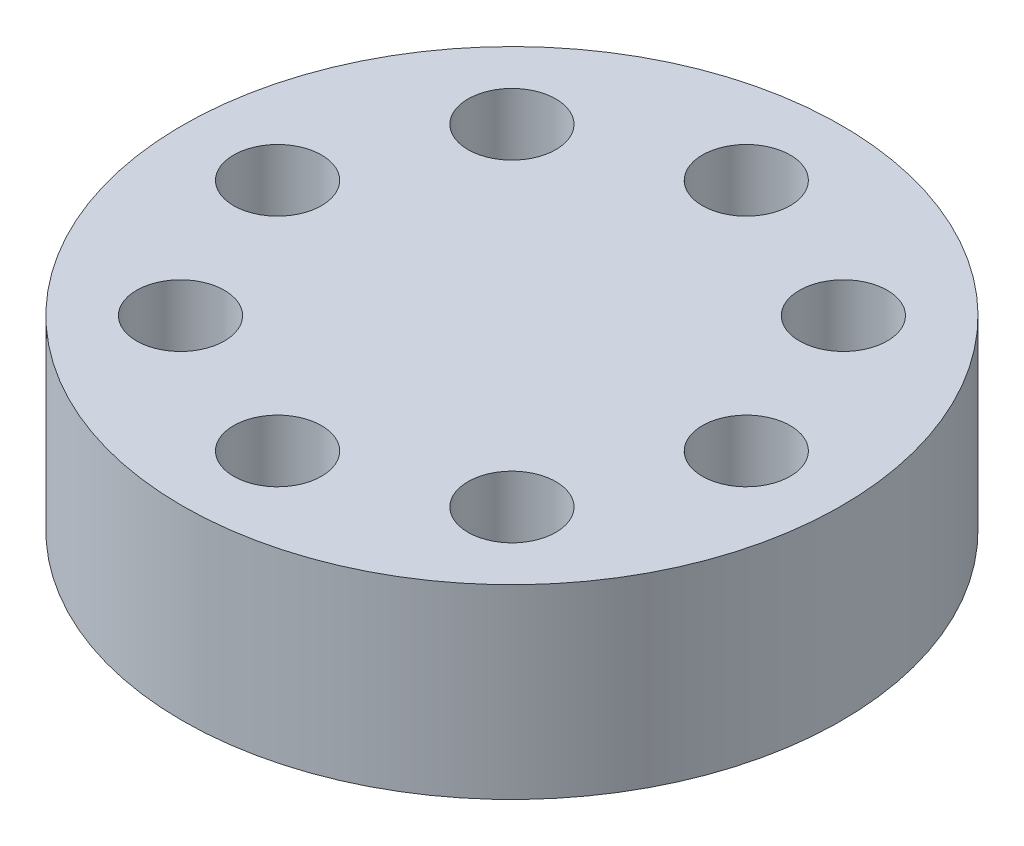
ISO-10303-21;
HEADER;
FILE_DESCRIPTION(('STEP AP214'),'2;1');
FILE_NAME('part.step','',(''),(''),'','','');
FILE_SCHEMA(('AUTOMOTIVE_DESIGN { 1 0 10303 214 1 1 1 1 }'));
ENDSEC;
DATA;
#1=APPLICATION_CONTEXT('core data for automotive mechanical design processes');
#2=APPLICATION_PROTOCOL_DEFINITION('international standard','automotive_design',2000,#1);
#3=PRODUCT_CONTEXT('',#1,'mechanical');
#4=PRODUCT('Part','Part','',(#3));
#5=PRODUCT_RELATED_PRODUCT_CATEGORY('part','',(#4));
#6=PRODUCT_DEFINITION_FORMATION('','',#4);
#7=PRODUCT_DEFINITION_CONTEXT('part definition',#1,'design');
#8=PRODUCT_DEFINITION('design','',#6,#7);
#9=PRODUCT_DEFINITION_SHAPE('','',#8);
#10=(LENGTH_UNIT() NAMED_UNIT(*) SI_UNIT(.MILLI.,.METRE.));
#11=(NAMED_UNIT(*) PLANE_ANGLE_UNIT() SI_UNIT($,.RADIAN.));
#12=(NAMED_UNIT(*) SI_UNIT($,.STERADIAN.) SOLID_ANGLE_UNIT());
#13=UNCERTAINTY_MEASURE_WITH_UNIT(LENGTH_MEASURE(1.E-05),#10,'distance_accuracy_value','');
#14=(GEOMETRIC_REPRESENTATION_CONTEXT(3) GLOBAL_UNCERTAINTY_ASSIGNED_CONTEXT((#13)) GLOBAL_UNIT_ASSIGNED_CONTEXT((#10,
#11,#12)) REPRESENTATION_CONTEXT('',''));
#15=CARTESIAN_POINT('',(0.,0.,0.));
#16=DIRECTION('',(0.,0.,1.));
#17=DIRECTION('',(1.,0.,0.));
#18=AXIS2_PLACEMENT_3D('',#15,#16,#17);
#19=CARTESIAN_POINT('',(0.,12.7,0.));
#20=DIRECTION('',(0.,-1.,0.));
#21=DIRECTION('',(0.,0.,-1.));
#22=AXIS2_PLACEMENT_3D('',#19,#20,#21);
#23=CYLINDRICAL_SURFACE('',#22,22.5);
#24=CARTESIAN_POINT('',(0.,12.7,0.));
#25=DIRECTION('',(0.,1.,0.));
#26=DIRECTION('',(0.,0.,1.));
#27=AXIS2_PLACEMENT_3D('',#24,#25,#26);
#28=CIRCLE('',#27,22.5);
#29=CARTESIAN_POINT('',(0.,12.7,22.5));
#30=VERTEX_POINT('',#29);
#31=EDGE_CURVE('E10',#30,#30,#28,.T.);
#32=ORIENTED_EDGE('',*,*,#31,.F.);
#33=EDGE_LOOP('',(#32));
#34=FACE_BOUND('',#33,.T.);
#35=CARTESIAN_POINT('',(0.,0.,0.));
#36=DIRECTION('',(0.,1.,0.));
#37=DIRECTION('',(0.,0.,1.));
#38=AXIS2_PLACEMENT_3D('',#35,#36,#37);
#39=CIRCLE('',#38,22.5);
#40=CARTESIAN_POINT('',(0.,0.,22.5));
#41=VERTEX_POINT('',#40);
#42=EDGE_CURVE('E37',#41,#41,#39,.T.);
#43=ORIENTED_EDGE('',*,*,#42,.T.);
#44=EDGE_LOOP('',(#43));
#45=FACE_BOUND('',#44,.T.);
#46=ADVANCED_FACE('F34',(#34,#45),#23,.T.);
#47=CARTESIAN_POINT('',(0.,12.7,0.));
#48=DIRECTION('',(0.,1.,0.));
#49=DIRECTION('',(0.,0.,1.));
#50=AXIS2_PLACEMENT_3D('',#47,#48,#49);
#51=PLANE('',#50);
#52=CARTESIAN_POINT('',(-11.3137084989848,12.7,11.3137084989848));
#53=DIRECTION('',(0.,1.,0.));
#54=DIRECTION('',(0.,0.,1.));
#55=AXIS2_PLACEMENT_3D('',#52,#53,#54);
#56=CIRCLE('',#55,3.00000000000006);
#57=CARTESIAN_POINT('',(-11.3137084989848,12.7,14.3137084989848));
#58=VERTEX_POINT('',#57);
#59=EDGE_CURVE('E55',#58,#58,#56,.T.);
#60=ORIENTED_EDGE('',*,*,#59,.F.);
#61=EDGE_LOOP('',(#60));
#62=FACE_BOUND('',#61,.T.);
#63=CARTESIAN_POINT('',(-1.6759110426447E-13,12.7,16.));
#64=DIRECTION('',(0.,1.,0.));
#65=DIRECTION('',(0.,0.,1.));
#66=AXIS2_PLACEMENT_3D('',#63,#64,#65);
#67=CIRCLE('',#66,3.);
#68=CARTESIAN_POINT('',(-1.6759110426447E-13,12.7,19.));
#69=VERTEX_POINT('',#68);
#70=EDGE_CURVE('E61',#69,#69,#67,.T.);
#71=ORIENTED_EDGE('',*,*,#70,.F.);
#72=EDGE_LOOP('',(#71));
#73=FACE_BOUND('',#72,.T.);
#74=CARTESIAN_POINT('',(11.3137084989847,12.7,11.3137084989849));
#75=DIRECTION('',(0.,1.,0.));
#76=DIRECTION('',(0.,0.,1.));
#77=AXIS2_PLACEMENT_3D('',#74,#75,#76);
#78=CIRCLE('',#77,3.);
#79=CARTESIAN_POINT('',(11.3137084989847,12.7,14.3137084989849));
#80=VERTEX_POINT('',#79);
#81=EDGE_CURVE('E67',#80,#80,#78,.T.);
#82=ORIENTED_EDGE('',*,*,#81,.F.);
#83=EDGE_LOOP('',(#82));
#84=FACE_BOUND('',#83,.T.);
#85=CARTESIAN_POINT('',(16.,12.7,1.1172740284298E-13));
#86=DIRECTION('',(0.,1.,0.));
#87=DIRECTION('',(0.,0.,1.));
#88=AXIS2_PLACEMENT_3D('',#85,#86,#87);
#89=CIRCLE('',#88,3.);
#90=CARTESIAN_POINT('',(16.,12.7,3.00000000000011));
#91=VERTEX_POINT('',#90);
#92=EDGE_CURVE('E73',#91,#91,#89,.T.);
#93=ORIENTED_EDGE('',*,*,#92,.F.);
#94=EDGE_LOOP('',(#93));
#95=FACE_BOUND('',#94,.T.);
#96=CARTESIAN_POINT('',(11.3137084989848,12.7,-11.3137084989847));
#97=DIRECTION('',(0.,1.,0.));
#98=DIRECTION('',(0.,0.,1.));
#99=AXIS2_PLACEMENT_3D('',#96,#97,#98);
#100=CIRCLE('',#99,3.);
#101=CARTESIAN_POINT('',(11.3137084989848,12.7,-8.3137084989847));
#102=VERTEX_POINT('',#101);
#103=EDGE_CURVE('E79',#102,#102,#100,.T.);
#104=ORIENTED_EDGE('',*,*,#103,.F.);
#105=EDGE_LOOP('',(#104));
#106=FACE_BOUND('',#105,.T.);
#107=CARTESIAN_POINT('',(0.,12.7,-16.));
#108=DIRECTION('',(0.,1.,0.));
#109=DIRECTION('',(0.,0.,1.));
#110=AXIS2_PLACEMENT_3D('',#107,#108,#109);
#111=CIRCLE('',#110,3.);
#112=CARTESIAN_POINT('',(0.,12.7,-13.));
#113=VERTEX_POINT('',#112);
#114=EDGE_CURVE('E85',#113,#113,#111,.T.);
#115=ORIENTED_EDGE('',*,*,#114,.F.);
#116=EDGE_LOOP('',(#115));
#117=FACE_BOUND('',#116,.T.);
#118=CARTESIAN_POINT('',(-11.3137084989848,12.7,-11.3137084989848));
#119=DIRECTION('',(0.,1.,0.));
#120=DIRECTION('',(0.,0.,1.));
#121=AXIS2_PLACEMENT_3D('',#118,#119,#120);
#122=CIRCLE('',#121,3.00000000000001);
#123=CARTESIAN_POINT('',(-11.3137084989848,12.7,-8.31370849898475));
#124=VERTEX_POINT('',#123);
#125=EDGE_CURVE('E49',#124,#124,#122,.T.);
#126=ORIENTED_EDGE('',*,*,#125,.F.);
#127=EDGE_LOOP('',(#126));
#128=FACE_BOUND('',#127,.T.);
#129=CARTESIAN_POINT('',(-16.,12.7,0.));
#130=DIRECTION('',(0.,1.,0.));
#131=DIRECTION('',(0.,0.,1.));
#132=AXIS2_PLACEMENT_3D('',#129,#130,#131);
#133=CIRCLE('',#132,3.);
#134=CARTESIAN_POINT('',(-16.,12.7,3.));
#135=VERTEX_POINT('',#134);
#136=EDGE_CURVE('E46',#135,#135,#133,.T.);
#137=ORIENTED_EDGE('',*,*,#136,.F.);
#138=EDGE_LOOP('',(#137));
#139=FACE_BOUND('',#138,.T.);
#140=ORIENTED_EDGE('',*,*,#31,.T.);
#141=EDGE_LOOP('',(#140));
#142=FACE_BOUND('',#141,.T.);
#143=ADVANCED_FACE('F96',(#62,#73,#84,#95,#106,#117,#128,#139,#142),#51,.T.);
#144=CARTESIAN_POINT('',(0.,0.,0.));
#145=DIRECTION('',(0.,1.,0.));
#146=DIRECTION('',(0.,0.,1.));
#147=AXIS2_PLACEMENT_3D('',#144,#145,#146);
#148=PLANE('',#147);
#149=CARTESIAN_POINT('',(-11.3137084989848,0.,11.3137084989848));
#150=DIRECTION('',(0.,1.,0.));
#151=DIRECTION('',(0.,0.,1.));
#152=AXIS2_PLACEMENT_3D('',#149,#150,#151);
#153=CIRCLE('',#152,3.00000000000006);
#154=CARTESIAN_POINT('',(-11.3137084989848,0.,14.3137084989848));
#155=VERTEX_POINT('',#154);
#156=EDGE_CURVE('E52',#155,#155,#153,.T.);
#157=ORIENTED_EDGE('',*,*,#156,.T.);
#158=EDGE_LOOP('',(#157));
#159=FACE_BOUND('',#158,.T.);
#160=CARTESIAN_POINT('',(-1.6759110426447E-13,0.,16.));
#161=DIRECTION('',(0.,1.,0.));
#162=DIRECTION('',(0.,0.,1.));
#163=AXIS2_PLACEMENT_3D('',#160,#161,#162);
#164=CIRCLE('',#163,3.);
#165=CARTESIAN_POINT('',(-1.6759110426447E-13,0.,19.));
#166=VERTEX_POINT('',#165);
#167=EDGE_CURVE('E58',#166,#166,#164,.T.);
#168=ORIENTED_EDGE('',*,*,#167,.T.);
#169=EDGE_LOOP('',(#168));
#170=FACE_BOUND('',#169,.T.);
#171=CARTESIAN_POINT('',(11.3137084989847,0.,11.3137084989849));
#172=DIRECTION('',(0.,1.,0.));
#173=DIRECTION('',(0.,0.,1.));
#174=AXIS2_PLACEMENT_3D('',#171,#172,#173);
#175=CIRCLE('',#174,3.);
#176=CARTESIAN_POINT('',(11.3137084989847,0.,14.3137084989849));
#177=VERTEX_POINT('',#176);
#178=EDGE_CURVE('E64',#177,#177,#175,.T.);
#179=ORIENTED_EDGE('',*,*,#178,.T.);
#180=EDGE_LOOP('',(#179));
#181=FACE_BOUND('',#180,.T.);
#182=CARTESIAN_POINT('',(16.,0.,1.1172740284298E-13));
#183=DIRECTION('',(0.,1.,0.));
#184=DIRECTION('',(0.,0.,1.));
#185=AXIS2_PLACEMENT_3D('',#182,#183,#184);
#186=CIRCLE('',#185,3.);
#187=CARTESIAN_POINT('',(16.,0.,3.00000000000011));
#188=VERTEX_POINT('',#187);
#189=EDGE_CURVE('E70',#188,#188,#186,.T.);
#190=ORIENTED_EDGE('',*,*,#189,.T.);
#191=EDGE_LOOP('',(#190));
#192=FACE_BOUND('',#191,.T.);
#193=CARTESIAN_POINT('',(11.3137084989848,0.,-11.3137084989847));
#194=DIRECTION('',(0.,1.,0.));
#195=DIRECTION('',(0.,0.,1.));
#196=AXIS2_PLACEMENT_3D('',#193,#194,#195);
#197=CIRCLE('',#196,3.);
#198=CARTESIAN_POINT('',(11.3137084989848,0.,-8.3137084989847));
#199=VERTEX_POINT('',#198);
#200=EDGE_CURVE('E76',#199,#199,#197,.T.);
#201=ORIENTED_EDGE('',*,*,#200,.T.);
#202=EDGE_LOOP('',(#201));
#203=FACE_BOUND('',#202,.T.);
#204=CARTESIAN_POINT('',(0.,0.,-16.));
#205=DIRECTION('',(0.,1.,0.));
#206=DIRECTION('',(0.,0.,1.));
#207=AXIS2_PLACEMENT_3D('',#204,#205,#206);
#208=CIRCLE('',#207,3.);
#209=CARTESIAN_POINT('',(0.,0.,-13.));
#210=VERTEX_POINT('',#209);
#211=EDGE_CURVE('E82',#210,#210,#208,.T.);
#212=ORIENTED_EDGE('',*,*,#211,.T.);
#213=EDGE_LOOP('',(#212));
#214=FACE_BOUND('',#213,.T.);
#215=CARTESIAN_POINT('',(-11.3137084989848,0.,-11.3137084989848));
#216=DIRECTION('',(0.,1.,0.));
#217=DIRECTION('',(0.,0.,1.));
#218=AXIS2_PLACEMENT_3D('',#215,#216,#217);
#219=CIRCLE('',#218,3.00000000000001);
#220=CARTESIAN_POINT('',(-11.3137084989848,0.,-8.31370849898475));
#221=VERTEX_POINT('',#220);
#222=EDGE_CURVE('E88',#221,#221,#219,.T.);
#223=ORIENTED_EDGE('',*,*,#222,.T.);
#224=EDGE_LOOP('',(#223));
#225=FACE_BOUND('',#224,.T.);
#226=CARTESIAN_POINT('',(-16.,0.,0.));
#227=DIRECTION('',(0.,1.,0.));
#228=DIRECTION('',(0.,0.,1.));
#229=AXIS2_PLACEMENT_3D('',#226,#227,#228);
#230=CIRCLE('',#229,3.);
#231=CARTESIAN_POINT('',(-16.,0.,3.));
#232=VERTEX_POINT('',#231);
#233=EDGE_CURVE('E44',#232,#232,#230,.T.);
#234=ORIENTED_EDGE('',*,*,#233,.T.);
#235=EDGE_LOOP('',(#234));
#236=FACE_BOUND('',#235,.T.);
#237=ORIENTED_EDGE('',*,*,#42,.F.);
#238=EDGE_LOOP('',(#237));
#239=FACE_BOUND('',#238,.T.);
#240=ADVANCED_FACE('F99',(#159,#170,#181,#192,#203,#214,#225,#236,#239),#148,.F.);
#241=CARTESIAN_POINT('',(-16.,0.,0.));
#242=DIRECTION('',(0.,1.,0.));
#243=DIRECTION('',(0.,0.,1.));
#244=AXIS2_PLACEMENT_3D('',#241,#242,#243);
#245=CYLINDRICAL_SURFACE('',#244,3.);
#246=ORIENTED_EDGE('',*,*,#233,.F.);
#247=EDGE_LOOP('',(#246));
#248=FACE_BOUND('',#247,.T.);
#249=ORIENTED_EDGE('',*,*,#136,.T.);
#250=EDGE_LOOP('',(#249));
#251=FACE_BOUND('',#250,.T.);
#252=ADVANCED_FACE('F104',(#248,#251),#245,.F.);
#253=CARTESIAN_POINT('',(-11.3137084989848,0.,-11.3137084989848));
#254=DIRECTION('',(0.,1.,0.));
#255=DIRECTION('',(0.,0.,1.));
#256=AXIS2_PLACEMENT_3D('',#253,#254,#255);
#257=CYLINDRICAL_SURFACE('',#256,3.00000000000001);
#258=ORIENTED_EDGE('',*,*,#222,.F.);
#259=EDGE_LOOP('',(#258));
#260=FACE_BOUND('',#259,.T.);
#261=ORIENTED_EDGE('',*,*,#125,.T.);
#262=EDGE_LOOP('',(#261));
#263=FACE_BOUND('',#262,.T.);
#264=ADVANCED_FACE('F94',(#260,#263),#257,.F.);
#265=CARTESIAN_POINT('',(0.,0.,-16.));
#266=DIRECTION('',(0.,1.,0.));
#267=DIRECTION('',(0.,0.,1.));
#268=AXIS2_PLACEMENT_3D('',#265,#266,#267);
#269=CYLINDRICAL_SURFACE('',#268,3.);
#270=ORIENTED_EDGE('',*,*,#211,.F.);
#271=EDGE_LOOP('',(#270));
#272=FACE_BOUND('',#271,.T.);
#273=ORIENTED_EDGE('',*,*,#114,.T.);
#274=EDGE_LOOP('',(#273));
#275=FACE_BOUND('',#274,.T.);
#276=ADVANCED_FACE('F112',(#272,#275),#269,.F.);
#277=CARTESIAN_POINT('',(11.3137084989848,0.,-11.3137084989847));
#278=DIRECTION('',(0.,1.,0.));
#279=DIRECTION('',(0.,0.,1.));
#280=AXIS2_PLACEMENT_3D('',#277,#278,#279);
#281=CYLINDRICAL_SURFACE('',#280,3.);
#282=ORIENTED_EDGE('',*,*,#200,.F.);
#283=EDGE_LOOP('',(#282));
#284=FACE_BOUND('',#283,.T.);
#285=ORIENTED_EDGE('',*,*,#103,.T.);
#286=EDGE_LOOP('',(#285));
#287=FACE_BOUND('',#286,.T.);
#288=ADVANCED_FACE('F155',(#284,#287),#281,.F.);
#289=CARTESIAN_POINT('',(16.,0.,1.1172740284298E-13));
#290=DIRECTION('',(0.,1.,0.));
#291=DIRECTION('',(0.,0.,1.));
#292=AXIS2_PLACEMENT_3D('',#289,#290,#291);
#293=CYLINDRICAL_SURFACE('',#292,3.);
#294=ORIENTED_EDGE('',*,*,#189,.F.);
#295=EDGE_LOOP('',(#294));
#296=FACE_BOUND('',#295,.T.);
#297=ORIENTED_EDGE('',*,*,#92,.T.);
#298=EDGE_LOOP('',(#297));
#299=FACE_BOUND('',#298,.T.);
#300=ADVANCED_FACE('F166',(#296,#299),#293,.F.);
#301=CARTESIAN_POINT('',(11.3137084989847,0.,11.3137084989849));
#302=DIRECTION('',(0.,1.,0.));
#303=DIRECTION('',(0.,0.,1.));
#304=AXIS2_PLACEMENT_3D('',#301,#302,#303);
#305=CYLINDRICAL_SURFACE('',#304,3.);
#306=ORIENTED_EDGE('',*,*,#178,.F.);
#307=EDGE_LOOP('',(#306));
#308=FACE_BOUND('',#307,.T.);
#309=ORIENTED_EDGE('',*,*,#81,.T.);
#310=EDGE_LOOP('',(#309));
#311=FACE_BOUND('',#310,.T.);
#312=ADVANCED_FACE('F177',(#308,#311),#305,.F.);
#313=CARTESIAN_POINT('',(-1.6759110426447E-13,0.,16.));
#314=DIRECTION('',(0.,1.,0.));
#315=DIRECTION('',(0.,0.,1.));
#316=AXIS2_PLACEMENT_3D('',#313,#314,#315);
#317=CYLINDRICAL_SURFACE('',#316,3.);
#318=ORIENTED_EDGE('',*,*,#167,.F.);
#319=EDGE_LOOP('',(#318));
#320=FACE_BOUND('',#319,.T.);
#321=ORIENTED_EDGE('',*,*,#70,.T.);
#322=EDGE_LOOP('',(#321));
#323=FACE_BOUND('',#322,.T.);
#324=ADVANCED_FACE('F188',(#320,#323),#317,.F.);
#325=CARTESIAN_POINT('',(-11.3137084989848,0.,11.3137084989848));
#326=DIRECTION('',(0.,1.,0.));
#327=DIRECTION('',(0.,0.,1.));
#328=AXIS2_PLACEMENT_3D('',#325,#326,#327);
#329=CYLINDRICAL_SURFACE('',#328,3.00000000000006);
#330=ORIENTED_EDGE('',*,*,#156,.F.);
#331=EDGE_LOOP('',(#330));
#332=FACE_BOUND('',#331,.T.);
#333=ORIENTED_EDGE('',*,*,#59,.T.);
#334=EDGE_LOOP('',(#333));
#335=FACE_BOUND('',#334,.T.);
#336=ADVANCED_FACE('F199',(#332,#335),#329,.F.);
#337=CLOSED_SHELL('',(#46,#143,#240,#252,#264,#276,#288,#300,#312,#324,#336));
#338=MANIFOLD_SOLID_BREP('B2',#337);
#339=ADVANCED_BREP_SHAPE_REPRESENTATION('',(#18,#338),#14);
#340=SHAPE_DEFINITION_REPRESENTATION(#9,#339);
ENDSEC;
END-ISO-10303-21;
